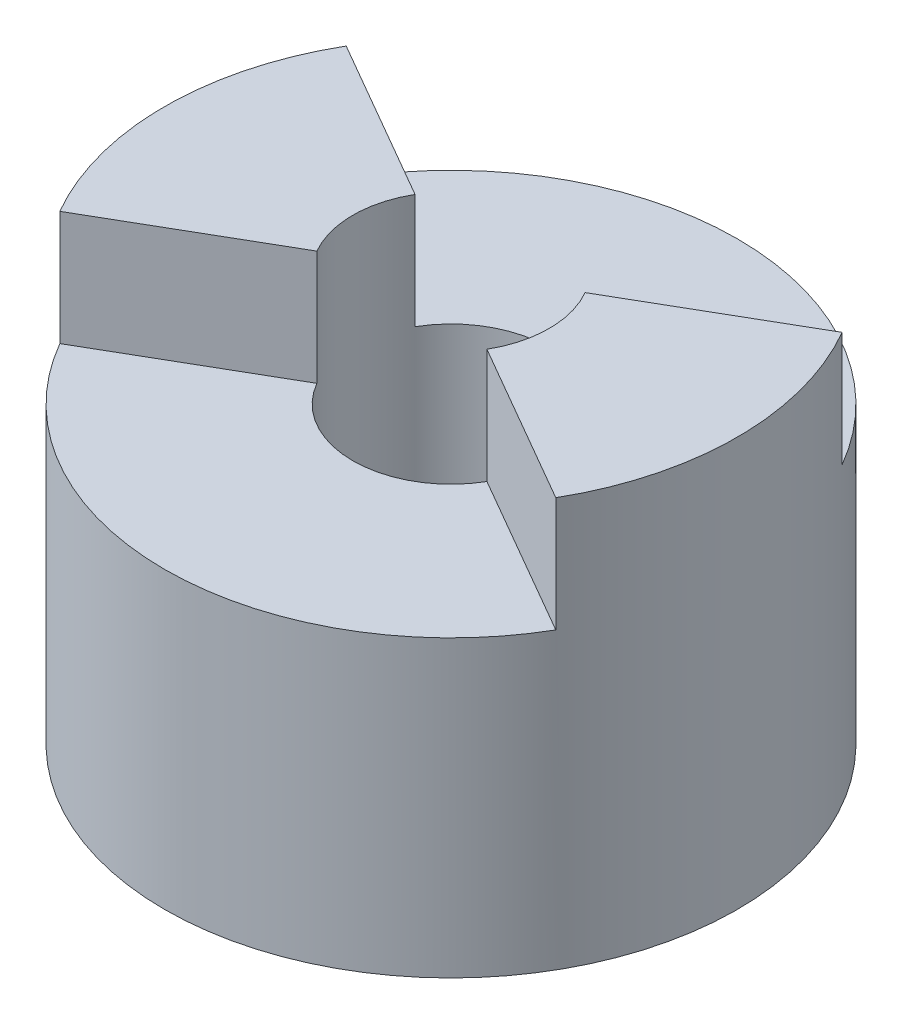
ISO-10303-21;
HEADER;
FILE_DESCRIPTION(('STEP AP214'),'2;1');
FILE_NAME('part.step','',(''),(''),'','','');
FILE_SCHEMA(('AUTOMOTIVE_DESIGN { 1 0 10303 214 1 1 1 1 }'));
ENDSEC;
DATA;
#1=APPLICATION_CONTEXT('core data for automotive mechanical design processes');
#2=APPLICATION_PROTOCOL_DEFINITION('international standard','automotive_design',2000,#1);
#3=PRODUCT_CONTEXT('',#1,'mechanical');
#4=PRODUCT('Part','Part','',(#3));
#5=PRODUCT_RELATED_PRODUCT_CATEGORY('part','',(#4));
#6=PRODUCT_DEFINITION_FORMATION('','',#4);
#7=PRODUCT_DEFINITION_CONTEXT('part definition',#1,'design');
#8=PRODUCT_DEFINITION('design','',#6,#7);
#9=PRODUCT_DEFINITION_SHAPE('','',#8);
#10=(LENGTH_UNIT() NAMED_UNIT(*) SI_UNIT(.MILLI.,.METRE.));
#11=(NAMED_UNIT(*) PLANE_ANGLE_UNIT() SI_UNIT($,.RADIAN.));
#12=(NAMED_UNIT(*) SI_UNIT($,.STERADIAN.) SOLID_ANGLE_UNIT());
#13=UNCERTAINTY_MEASURE_WITH_UNIT(LENGTH_MEASURE(1.E-05),#10,'distance_accuracy_value','');
#14=(GEOMETRIC_REPRESENTATION_CONTEXT(3) GLOBAL_UNCERTAINTY_ASSIGNED_CONTEXT((#13)) GLOBAL_UNIT_ASSIGNED_CONTEXT((#10,
#11,#12)) REPRESENTATION_CONTEXT('',''));
#15=CARTESIAN_POINT('',(0.,0.,0.));
#16=DIRECTION('',(0.,0.,1.));
#17=DIRECTION('',(1.,0.,0.));
#18=AXIS2_PLACEMENT_3D('',#15,#16,#17);
#19=CARTESIAN_POINT('',(0.,50.,0.));
#20=DIRECTION('',(0.,1.,0.));
#21=DIRECTION('',(0.,0.,1.));
#22=AXIS2_PLACEMENT_3D('',#19,#20,#21);
#23=PLANE('',#22);
#24=CARTESIAN_POINT('',(0.,50.,0.));
#25=DIRECTION('',(0.,1.,0.));
#26=DIRECTION('',(0.,0.,1.));
#27=AXIS2_PLACEMENT_3D('',#24,#25,#26);
#28=CIRCLE('',#27,12.);
#29=CARTESIAN_POINT('',(-10.3923048454133,50.,-5.99999999999998));
#30=VERTEX_POINT('',#29);
#31=CARTESIAN_POINT('',(-10.3923048454133,50.,5.99999999999998));
#32=VERTEX_POINT('',#31);
#33=EDGE_CURVE('E117',#30,#32,#28,.T.);
#34=ORIENTED_EDGE('',*,*,#33,.F.);
#35=DIRECTION('',(-0.86602540378444,0.,-0.499999999999998));
#36=VECTOR('',#35,1.);
#37=CARTESIAN_POINT('',(-10.3923048454133,50.,-5.99999999999998));
#38=LINE('',#37,#36);
#39=CARTESIAN_POINT('',(-30.3108891324554,50.,-17.4999999999999));
#40=VERTEX_POINT('',#39);
#41=EDGE_CURVE('E105',#30,#40,#38,.T.);
#42=ORIENTED_EDGE('',*,*,#41,.T.);
#43=CARTESIAN_POINT('',(0.,50.,0.));
#44=DIRECTION('',(0.,1.,0.));
#45=DIRECTION('',(0.,0.,1.));
#46=AXIS2_PLACEMENT_3D('',#43,#44,#45);
#47=CIRCLE('',#46,35.);
#48=CARTESIAN_POINT('',(-30.3108891324554,50.,17.4999999999999));
#49=VERTEX_POINT('',#48);
#50=EDGE_CURVE('E44',#40,#49,#47,.T.);
#51=ORIENTED_EDGE('',*,*,#50,.T.);
#52=DIRECTION('',(-0.86602540378444,0.,0.499999999999998));
#53=VECTOR('',#52,1.);
#54=CARTESIAN_POINT('',(-10.3923048454133,50.,5.99999999999998));
#55=LINE('',#54,#53);
#56=EDGE_CURVE('E136',#32,#49,#55,.T.);
#57=ORIENTED_EDGE('',*,*,#56,.F.);
#58=EDGE_LOOP('',(#34,#42,#51,#57));
#59=FACE_BOUND('',#58,.T.);
#60=ADVANCED_FACE('F35',(#59),#23,.T.);
#61=CARTESIAN_POINT('',(30.3108891324554,50.,17.4999999999999));
#62=VERTEX_POINT('',#61);
#63=CARTESIAN_POINT('',(30.3108891324554,50.,-17.4999999999999));
#64=VERTEX_POINT('',#63);
#65=EDGE_CURVE('E12',#62,#64,#47,.T.);
#66=ORIENTED_EDGE('',*,*,#65,.T.);
#67=DIRECTION('',(-0.86602540378444,0.,0.499999999999998));
#68=VECTOR('',#67,1.);
#69=CARTESIAN_POINT('',(10.3923048454133,50.,-5.99999999999998));
#70=LINE('',#69,#68);
#71=CARTESIAN_POINT('',(10.3923048454133,50.,-5.99999999999998));
#72=VERTEX_POINT('',#71);
#73=EDGE_CURVE('E111',#64,#72,#70,.T.);
#74=ORIENTED_EDGE('',*,*,#73,.T.);
#75=CARTESIAN_POINT('',(10.3923048454133,50.,5.99999999999998));
#76=VERTEX_POINT('',#75);
#77=EDGE_CURVE('E124',#76,#72,#28,.T.);
#78=ORIENTED_EDGE('',*,*,#77,.F.);
#79=DIRECTION('',(-0.86602540378444,0.,-0.499999999999998));
#80=VECTOR('',#79,1.);
#81=CARTESIAN_POINT('',(10.3923048454133,50.,5.99999999999998));
#82=LINE('',#81,#80);
#83=EDGE_CURVE('E145',#62,#76,#82,.T.);
#84=ORIENTED_EDGE('',*,*,#83,.F.);
#85=EDGE_LOOP('',(#66,#74,#78,#84));
#86=FACE_BOUND('',#85,.T.);
#87=ADVANCED_FACE('F176',(#86),#23,.T.);
#88=CARTESIAN_POINT('',(0.,50.,0.));
#89=DIRECTION('',(0.,-1.,0.));
#90=DIRECTION('',(0.,0.,-1.));
#91=AXIS2_PLACEMENT_3D('',#88,#89,#90);
#92=CYLINDRICAL_SURFACE('',#91,35.);
#93=CARTESIAN_POINT('',(0.,0.,0.));
#94=DIRECTION('',(0.,1.,0.));
#95=DIRECTION('',(0.,0.,1.));
#96=AXIS2_PLACEMENT_3D('',#93,#94,#95);
#97=CIRCLE('',#96,35.);
#98=CARTESIAN_POINT('',(0.,0.,35.));
#99=VERTEX_POINT('',#98);
#100=EDGE_CURVE('E39',#99,#99,#97,.T.);
#101=ORIENTED_EDGE('',*,*,#100,.T.);
#102=EDGE_LOOP('',(#101));
#103=FACE_BOUND('',#102,.T.);
#104=DIRECTION('',(0.,1.,0.));
#105=VECTOR('',#104,1.);
#106=CARTESIAN_POINT('',(-30.3108891324554,-67.2011904656459,-17.4999999999999));
#107=LINE('',#106,#105);
#108=CARTESIAN_POINT('',(-30.3108891324554,36.,-17.4999999999999));
#109=VERTEX_POINT('',#108);
#110=EDGE_CURVE('E102',#109,#40,#107,.T.);
#111=ORIENTED_EDGE('',*,*,#110,.F.);
#112=CARTESIAN_POINT('',(0.,36.,0.));
#113=DIRECTION('',(0.,1.,0.));
#114=DIRECTION('',(0.,0.,1.));
#115=AXIS2_PLACEMENT_3D('',#112,#113,#114);
#116=CIRCLE('',#115,35.);
#117=CARTESIAN_POINT('',(30.3108891324554,36.,-17.4999999999999));
#118=VERTEX_POINT('',#117);
#119=EDGE_CURVE('E147',#118,#109,#116,.T.);
#120=ORIENTED_EDGE('',*,*,#119,.F.);
#121=DIRECTION('',(0.,1.,0.));
#122=VECTOR('',#121,1.);
#123=CARTESIAN_POINT('',(30.3108891324554,-67.2011904656459,-17.4999999999999));
#124=LINE('',#123,#122);
#125=EDGE_CURVE('E154',#118,#64,#124,.T.);
#126=ORIENTED_EDGE('',*,*,#125,.T.);
#127=ORIENTED_EDGE('',*,*,#65,.F.);
#128=DIRECTION('',(0.,1.,0.));
#129=VECTOR('',#128,1.);
#130=CARTESIAN_POINT('',(30.3108891324554,-67.2011904656459,17.4999999999999));
#131=LINE('',#130,#129);
#132=CARTESIAN_POINT('',(30.3108891324554,36.,17.4999999999999));
#133=VERTEX_POINT('',#132);
#134=EDGE_CURVE('E133',#133,#62,#131,.T.);
#135=ORIENTED_EDGE('',*,*,#134,.F.);
#136=CARTESIAN_POINT('',(0.,36.,0.));
#137=DIRECTION('',(0.,1.,0.));
#138=DIRECTION('',(0.,0.,1.));
#139=AXIS2_PLACEMENT_3D('',#136,#137,#138);
#140=CIRCLE('',#139,35.);
#141=CARTESIAN_POINT('',(-30.3108891324554,36.,17.4999999999999));
#142=VERTEX_POINT('',#141);
#143=EDGE_CURVE('E132',#133,#142,#140,.F.);
#144=ORIENTED_EDGE('',*,*,#143,.T.);
#145=DIRECTION('',(0.,1.,0.));
#146=VECTOR('',#145,1.);
#147=CARTESIAN_POINT('',(-30.3108891324554,-67.2011904656459,17.4999999999999));
#148=LINE('',#147,#146);
#149=EDGE_CURVE('E122',#142,#49,#148,.T.);
#150=ORIENTED_EDGE('',*,*,#149,.T.);
#151=ORIENTED_EDGE('',*,*,#50,.F.);
#152=EDGE_LOOP('',(#111,#120,#126,#127,#135,#144,#150,#151));
#153=FACE_BOUND('',#152,.T.);
#154=ADVANCED_FACE('F37',(#103,#153),#92,.T.);
#155=CARTESIAN_POINT('',(0.,50.,0.));
#156=DIRECTION('',(0.,-1.,0.));
#157=DIRECTION('',(0.,0.,-1.));
#158=AXIS2_PLACEMENT_3D('',#155,#156,#157);
#159=CYLINDRICAL_SURFACE('',#158,12.);
#160=CARTESIAN_POINT('',(0.,0.,0.));
#161=DIRECTION('',(0.,1.,0.));
#162=DIRECTION('',(0.,0.,1.));
#163=AXIS2_PLACEMENT_3D('',#160,#161,#162);
#164=CIRCLE('',#163,12.);
#165=CARTESIAN_POINT('',(0.,0.,12.));
#166=VERTEX_POINT('',#165);
#167=EDGE_CURVE('E126',#166,#166,#164,.T.);
#168=ORIENTED_EDGE('',*,*,#167,.F.);
#169=EDGE_LOOP('',(#168));
#170=FACE_BOUND('',#169,.T.);
#171=CARTESIAN_POINT('',(0.,36.,0.));
#172=DIRECTION('',(0.,1.,0.));
#173=DIRECTION('',(0.,0.,1.));
#174=AXIS2_PLACEMENT_3D('',#171,#172,#173);
#175=CIRCLE('',#174,12.);
#176=CARTESIAN_POINT('',(-10.3923048454133,36.,-5.99999999999998));
#177=VERTEX_POINT('',#176);
#178=CARTESIAN_POINT('',(10.3923048454133,36.,-5.99999999999998));
#179=VERTEX_POINT('',#178);
#180=EDGE_CURVE('E153',#177,#179,#175,.F.);
#181=ORIENTED_EDGE('',*,*,#180,.F.);
#182=DIRECTION('',(0.,1.,0.));
#183=VECTOR('',#182,1.);
#184=CARTESIAN_POINT('',(-10.3923048454133,-67.2011904656459,-5.99999999999998));
#185=LINE('',#184,#183);
#186=EDGE_CURVE('E110',#177,#30,#185,.T.);
#187=ORIENTED_EDGE('',*,*,#186,.T.);
#188=ORIENTED_EDGE('',*,*,#33,.T.);
#189=DIRECTION('',(0.,1.,0.));
#190=VECTOR('',#189,1.);
#191=CARTESIAN_POINT('',(-10.3923048454133,-67.2011904656459,5.99999999999998));
#192=LINE('',#191,#190);
#193=CARTESIAN_POINT('',(-10.3923048454133,36.,5.99999999999998));
#194=VERTEX_POINT('',#193);
#195=EDGE_CURVE('E139',#194,#32,#192,.T.);
#196=ORIENTED_EDGE('',*,*,#195,.F.);
#197=CARTESIAN_POINT('',(0.,36.,0.));
#198=DIRECTION('',(0.,1.,0.));
#199=DIRECTION('',(0.,0.,1.));
#200=AXIS2_PLACEMENT_3D('',#197,#198,#199);
#201=CIRCLE('',#200,12.);
#202=CARTESIAN_POINT('',(10.3923048454133,36.,5.99999999999998));
#203=VERTEX_POINT('',#202);
#204=EDGE_CURVE('E143',#194,#203,#201,.T.);
#205=ORIENTED_EDGE('',*,*,#204,.T.);
#206=DIRECTION('',(0.,1.,0.));
#207=VECTOR('',#206,1.);
#208=CARTESIAN_POINT('',(10.3923048454133,-67.2011904656459,5.99999999999998));
#209=LINE('',#208,#207);
#210=EDGE_CURVE('E135',#203,#76,#209,.T.);
#211=ORIENTED_EDGE('',*,*,#210,.T.);
#212=ORIENTED_EDGE('',*,*,#77,.T.);
#213=DIRECTION('',(0.,1.,0.));
#214=VECTOR('',#213,1.);
#215=CARTESIAN_POINT('',(10.3923048454133,-67.2011904656459,-5.99999999999998));
#216=LINE('',#215,#214);
#217=EDGE_CURVE('E157',#179,#72,#216,.T.);
#218=ORIENTED_EDGE('',*,*,#217,.F.);
#219=EDGE_LOOP('',(#181,#187,#188,#196,#205,#211,#212,#218));
#220=FACE_BOUND('',#219,.T.);
#221=ADVANCED_FACE('F171',(#170,#220),#159,.F.);
#222=CARTESIAN_POINT('',(0.,0.,0.));
#223=DIRECTION('',(0.,1.,0.));
#224=DIRECTION('',(0.,0.,1.));
#225=AXIS2_PLACEMENT_3D('',#222,#223,#224);
#226=PLANE('',#225);
#227=ORIENTED_EDGE('',*,*,#100,.F.);
#228=EDGE_LOOP('',(#227));
#229=FACE_BOUND('',#228,.T.);
#230=ORIENTED_EDGE('',*,*,#167,.T.);
#231=EDGE_LOOP('',(#230));
#232=FACE_BOUND('',#231,.T.);
#233=ADVANCED_FACE('F187',(#229,#232),#226,.F.);
#234=CARTESIAN_POINT('',(-10.3923048454133,-67.2011904656459,5.99999999999998));
#235=DIRECTION('',(-0.499999999999998,0.,-0.86602540378444));
#236=DIRECTION('',(-0.86602540378444,0.,0.499999999999998));
#237=AXIS2_PLACEMENT_3D('',#234,#235,#236);
#238=PLANE('',#237);
#239=DIRECTION('',(0.86602540378444,0.,-0.499999999999998));
#240=VECTOR('',#239,1.);
#241=CARTESIAN_POINT('',(-10.3923048454133,36.,5.99999999999998));
#242=LINE('',#241,#240);
#243=EDGE_CURVE('E149',#142,#194,#242,.T.);
#244=ORIENTED_EDGE('',*,*,#243,.T.);
#245=ORIENTED_EDGE('',*,*,#195,.T.);
#246=ORIENTED_EDGE('',*,*,#56,.T.);
#247=ORIENTED_EDGE('',*,*,#149,.F.);
#248=EDGE_LOOP('',(#244,#245,#246,#247));
#249=FACE_BOUND('',#248,.T.);
#250=ADVANCED_FACE('F185',(#249),#238,.F.);
#251=CARTESIAN_POINT('',(10.3923048454133,-67.2011904656459,5.99999999999998));
#252=DIRECTION('',(0.499999999999998,0.,-0.86602540378444));
#253=DIRECTION('',(-0.86602540378444,0.,-0.499999999999998));
#254=AXIS2_PLACEMENT_3D('',#251,#252,#253);
#255=PLANE('',#254);
#256=DIRECTION('',(0.86602540378444,0.,0.499999999999998));
#257=VECTOR('',#256,1.);
#258=CARTESIAN_POINT('',(10.3923048454133,36.,5.99999999999998));
#259=LINE('',#258,#257);
#260=EDGE_CURVE('E59',#203,#133,#259,.T.);
#261=ORIENTED_EDGE('',*,*,#260,.T.);
#262=ORIENTED_EDGE('',*,*,#134,.T.);
#263=ORIENTED_EDGE('',*,*,#83,.T.);
#264=ORIENTED_EDGE('',*,*,#210,.F.);
#265=EDGE_LOOP('',(#261,#262,#263,#264));
#266=FACE_BOUND('',#265,.T.);
#267=ADVANCED_FACE('F181',(#266),#255,.F.);
#268=CARTESIAN_POINT('',(0.,36.,0.));
#269=DIRECTION('',(0.,1.,0.));
#270=DIRECTION('',(0.,0.,1.));
#271=AXIS2_PLACEMENT_3D('',#268,#269,#270);
#272=PLANE('',#271);
#273=ORIENTED_EDGE('',*,*,#143,.F.);
#274=ORIENTED_EDGE('',*,*,#260,.F.);
#275=ORIENTED_EDGE('',*,*,#204,.F.);
#276=ORIENTED_EDGE('',*,*,#243,.F.);
#277=EDGE_LOOP('',(#273,#274,#275,#276));
#278=FACE_BOUND('',#277,.T.);
#279=ADVANCED_FACE('F182',(#278),#272,.T.);
#280=CARTESIAN_POINT('',(-10.3923048454133,-67.2011904656459,-5.99999999999998));
#281=DIRECTION('',(0.499999999999998,0.,-0.86602540378444));
#282=DIRECTION('',(-0.86602540378444,0.,-0.499999999999998));
#283=AXIS2_PLACEMENT_3D('',#280,#281,#282);
#284=PLANE('',#283);
#285=ORIENTED_EDGE('',*,*,#110,.T.);
#286=ORIENTED_EDGE('',*,*,#41,.F.);
#287=ORIENTED_EDGE('',*,*,#186,.F.);
#288=DIRECTION('',(0.86602540378444,0.,0.499999999999998));
#289=VECTOR('',#288,1.);
#290=CARTESIAN_POINT('',(-10.3923048454133,36.,-5.99999999999998));
#291=LINE('',#290,#289);
#292=EDGE_CURVE('E51',#109,#177,#291,.T.);
#293=ORIENTED_EDGE('',*,*,#292,.F.);
#294=EDGE_LOOP('',(#285,#286,#287,#293));
#295=FACE_BOUND('',#294,.T.);
#296=ADVANCED_FACE('F104',(#295),#284,.T.);
#297=CARTESIAN_POINT('',(10.3923048454133,-67.2011904656459,-5.99999999999998));
#298=DIRECTION('',(-0.499999999999998,0.,-0.86602540378444));
#299=DIRECTION('',(-0.86602540378444,0.,0.499999999999998));
#300=AXIS2_PLACEMENT_3D('',#297,#298,#299);
#301=PLANE('',#300);
#302=ORIENTED_EDGE('',*,*,#217,.T.);
#303=ORIENTED_EDGE('',*,*,#73,.F.);
#304=ORIENTED_EDGE('',*,*,#125,.F.);
#305=DIRECTION('',(0.86602540378444,0.,-0.499999999999998));
#306=VECTOR('',#305,1.);
#307=CARTESIAN_POINT('',(10.3923048454133,36.,-5.99999999999998));
#308=LINE('',#307,#306);
#309=EDGE_CURVE('E164',#179,#118,#308,.T.);
#310=ORIENTED_EDGE('',*,*,#309,.F.);
#311=EDGE_LOOP('',(#302,#303,#304,#310));
#312=FACE_BOUND('',#311,.T.);
#313=ADVANCED_FACE('F174',(#312),#301,.T.);
#314=CARTESIAN_POINT('',(0.,36.,0.));
#315=DIRECTION('',(0.,1.,0.));
#316=DIRECTION('',(0.,0.,1.));
#317=AXIS2_PLACEMENT_3D('',#314,#315,#316);
#318=PLANE('',#317);
#319=ORIENTED_EDGE('',*,*,#309,.T.);
#320=ORIENTED_EDGE('',*,*,#119,.T.);
#321=ORIENTED_EDGE('',*,*,#292,.T.);
#322=ORIENTED_EDGE('',*,*,#180,.T.);
#323=EDGE_LOOP('',(#319,#320,#321,#322));
#324=FACE_BOUND('',#323,.T.);
#325=ADVANCED_FACE('F169',(#324),#318,.T.);
#326=CLOSED_SHELL('',(#60,#87,#154,#221,#233,#250,#267,#279,#296,#313,#325));
#327=MANIFOLD_SOLID_BREP('B2',#326);
#328=ADVANCED_BREP_SHAPE_REPRESENTATION('',(#18,#327),#14);
#329=SHAPE_DEFINITION_REPRESENTATION(#9,#328);
ENDSEC;
END-ISO-10303-21;
